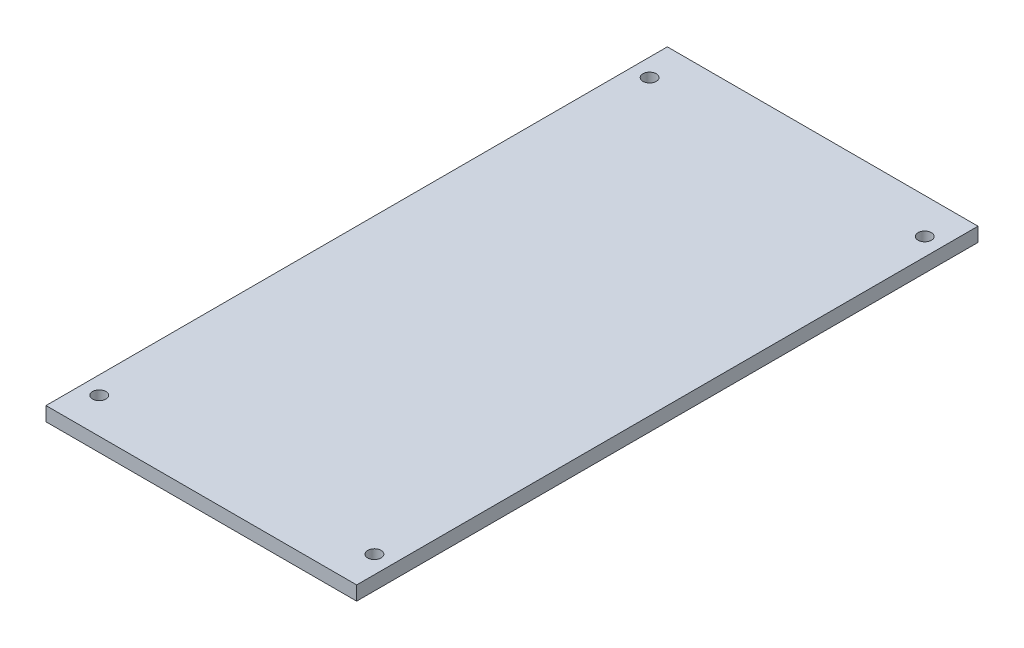
ISO-10303-21;
HEADER;
FILE_DESCRIPTION(('STEP AP214'),'2;1');
FILE_NAME('part.step','',(''),(''),'','','');
FILE_SCHEMA(('AUTOMOTIVE_DESIGN { 1 0 10303 214 1 1 1 1 }'));
ENDSEC;
DATA;
#1=APPLICATION_CONTEXT('core data for automotive mechanical design processes');
#2=APPLICATION_PROTOCOL_DEFINITION('international standard','automotive_design',2000,#1);
#3=PRODUCT_CONTEXT('',#1,'mechanical');
#4=PRODUCT('Part','Part','',(#3));
#5=PRODUCT_RELATED_PRODUCT_CATEGORY('part','',(#4));
#6=PRODUCT_DEFINITION_FORMATION('','',#4);
#7=PRODUCT_DEFINITION_CONTEXT('part definition',#1,'design');
#8=PRODUCT_DEFINITION('design','',#6,#7);
#9=PRODUCT_DEFINITION_SHAPE('','',#8);
#10=(LENGTH_UNIT() NAMED_UNIT(*) SI_UNIT(.MILLI.,.METRE.));
#11=(NAMED_UNIT(*) PLANE_ANGLE_UNIT() SI_UNIT($,.RADIAN.));
#12=(NAMED_UNIT(*) SI_UNIT($,.STERADIAN.) SOLID_ANGLE_UNIT());
#13=UNCERTAINTY_MEASURE_WITH_UNIT(LENGTH_MEASURE(1.E-05),#10,'distance_accuracy_value','');
#14=(GEOMETRIC_REPRESENTATION_CONTEXT(3) GLOBAL_UNCERTAINTY_ASSIGNED_CONTEXT((#13)) GLOBAL_UNIT_ASSIGNED_CONTEXT((#10,
#11,#12)) REPRESENTATION_CONTEXT('',''));
#15=CARTESIAN_POINT('',(0.,0.,0.));
#16=DIRECTION('',(0.,0.,1.));
#17=DIRECTION('',(1.,0.,0.));
#18=AXIS2_PLACEMENT_3D('',#15,#16,#17);
#19=CARTESIAN_POINT('',(0.,3.175,0.));
#20=DIRECTION('',(0.,1.,0.));
#21=DIRECTION('',(0.,0.,1.));
#22=AXIS2_PLACEMENT_3D('',#19,#20,#21);
#23=PLANE('',#22);
#24=CARTESIAN_POINT('',(-31.,3.175,-62.0000000000001));
#25=DIRECTION('',(0.,1.,0.));
#26=DIRECTION('',(0.,0.,1.));
#27=AXIS2_PLACEMENT_3D('',#24,#25,#26);
#28=CIRCLE('',#27,1.5);
#29=CARTESIAN_POINT('',(-31.,3.175,-60.5000000000001));
#30=VERTEX_POINT('',#29);
#31=EDGE_CURVE('E121',#30,#30,#28,.T.);
#32=ORIENTED_EDGE('',*,*,#31,.F.);
#33=EDGE_LOOP('',(#32));
#34=FACE_BOUND('',#33,.T.);
#35=CARTESIAN_POINT('',(31.,3.175,62.));
#36=DIRECTION('',(0.,1.,0.));
#37=DIRECTION('',(0.,0.,1.));
#38=AXIS2_PLACEMENT_3D('',#35,#36,#37);
#39=CIRCLE('',#38,1.5);
#40=CARTESIAN_POINT('',(31.,3.175,63.5));
#41=VERTEX_POINT('',#40);
#42=EDGE_CURVE('E100',#41,#41,#39,.T.);
#43=ORIENTED_EDGE('',*,*,#42,.F.);
#44=EDGE_LOOP('',(#43));
#45=FACE_BOUND('',#44,.T.);
#46=DIRECTION('',(0.,0.,1.));
#47=VECTOR('',#46,1.);
#48=CARTESIAN_POINT('',(-35.,3.175,70.));
#49=LINE('',#48,#47);
#50=CARTESIAN_POINT('',(-35.,3.175,-70.));
#51=VERTEX_POINT('',#50);
#52=CARTESIAN_POINT('',(-35.,3.175,70.));
#53=VERTEX_POINT('',#52);
#54=EDGE_CURVE('E85',#51,#53,#49,.T.);
#55=ORIENTED_EDGE('',*,*,#54,.T.);
#56=DIRECTION('',(1.,0.,0.));
#57=VECTOR('',#56,1.);
#58=CARTESIAN_POINT('',(35.,3.175,70.));
#59=LINE('',#58,#57);
#60=CARTESIAN_POINT('',(35.,3.175,70.));
#61=VERTEX_POINT('',#60);
#62=EDGE_CURVE('E80',#53,#61,#59,.T.);
#63=ORIENTED_EDGE('',*,*,#62,.T.);
#64=DIRECTION('',(0.,0.,-1.));
#65=VECTOR('',#64,1.);
#66=CARTESIAN_POINT('',(35.,3.175,70.));
#67=LINE('',#66,#65);
#68=CARTESIAN_POINT('',(35.,3.175,-70.));
#69=VERTEX_POINT('',#68);
#70=EDGE_CURVE('E83',#61,#69,#67,.T.);
#71=ORIENTED_EDGE('',*,*,#70,.T.);
#72=DIRECTION('',(-1.,0.,0.));
#73=VECTOR('',#72,1.);
#74=CARTESIAN_POINT('',(35.,3.175,-70.));
#75=LINE('',#74,#73);
#76=EDGE_CURVE('E50',#69,#51,#75,.T.);
#77=ORIENTED_EDGE('',*,*,#76,.T.);
#78=EDGE_LOOP('',(#55,#63,#71,#77));
#79=FACE_BOUND('',#78,.T.);
#80=CARTESIAN_POINT('',(30.9999999999999,3.175,-62.0000000000001));
#81=DIRECTION('',(0.,1.,0.));
#82=DIRECTION('',(0.,0.,-1.));
#83=AXIS2_PLACEMENT_3D('',#80,#81,#82);
#84=CIRCLE('',#83,1.5);
#85=CARTESIAN_POINT('',(30.9999999999999,3.175,-63.5000000000001));
#86=VERTEX_POINT('',#85);
#87=EDGE_CURVE('E115',#86,#86,#84,.T.);
#88=ORIENTED_EDGE('',*,*,#87,.F.);
#89=EDGE_LOOP('',(#88));
#90=FACE_BOUND('',#89,.T.);
#91=CARTESIAN_POINT('',(-31.,3.175,62.));
#92=DIRECTION('',(0.,1.,0.));
#93=DIRECTION('',(0.,0.,-1.));
#94=AXIS2_PLACEMENT_3D('',#91,#92,#93);
#95=CIRCLE('',#94,1.5);
#96=CARTESIAN_POINT('',(-31.,3.175,60.5));
#97=VERTEX_POINT('',#96);
#98=EDGE_CURVE('E127',#97,#97,#95,.T.);
#99=ORIENTED_EDGE('',*,*,#98,.F.);
#100=EDGE_LOOP('',(#99));
#101=FACE_BOUND('',#100,.T.);
#102=ADVANCED_FACE('F33',(#34,#45,#79,#90,#101),#23,.T.);
#103=CARTESIAN_POINT('',(0.,0.,0.));
#104=DIRECTION('',(0.,1.,0.));
#105=DIRECTION('',(0.,0.,1.));
#106=AXIS2_PLACEMENT_3D('',#103,#104,#105);
#107=PLANE('',#106);
#108=CARTESIAN_POINT('',(-31.,0.,-62.0000000000001));
#109=DIRECTION('',(0.,1.,0.));
#110=DIRECTION('',(0.,0.,1.));
#111=AXIS2_PLACEMENT_3D('',#108,#109,#110);
#112=CIRCLE('',#111,1.5);
#113=CARTESIAN_POINT('',(-31.,0.,-60.5000000000001));
#114=VERTEX_POINT('',#113);
#115=EDGE_CURVE('E124',#114,#114,#112,.T.);
#116=ORIENTED_EDGE('',*,*,#115,.T.);
#117=EDGE_LOOP('',(#116));
#118=FACE_BOUND('',#117,.T.);
#119=CARTESIAN_POINT('',(31.,0.,62.));
#120=DIRECTION('',(0.,1.,0.));
#121=DIRECTION('',(0.,0.,1.));
#122=AXIS2_PLACEMENT_3D('',#119,#120,#121);
#123=CIRCLE('',#122,1.5);
#124=CARTESIAN_POINT('',(31.,0.,63.5));
#125=VERTEX_POINT('',#124);
#126=EDGE_CURVE('E112',#125,#125,#123,.T.);
#127=ORIENTED_EDGE('',*,*,#126,.T.);
#128=EDGE_LOOP('',(#127));
#129=FACE_BOUND('',#128,.T.);
#130=DIRECTION('',(0.,0.,1.));
#131=VECTOR('',#130,1.);
#132=CARTESIAN_POINT('',(-35.,0.,70.));
#133=LINE('',#132,#131);
#134=CARTESIAN_POINT('',(-35.,0.,-70.));
#135=VERTEX_POINT('',#134);
#136=CARTESIAN_POINT('',(-35.,0.,70.));
#137=VERTEX_POINT('',#136);
#138=EDGE_CURVE('E97',#135,#137,#133,.T.);
#139=ORIENTED_EDGE('',*,*,#138,.F.);
#140=DIRECTION('',(-1.,0.,0.));
#141=VECTOR('',#140,1.);
#142=CARTESIAN_POINT('',(35.,0.,-70.));
#143=LINE('',#142,#141);
#144=CARTESIAN_POINT('',(35.,0.,-70.));
#145=VERTEX_POINT('',#144);
#146=EDGE_CURVE('E73',#145,#135,#143,.T.);
#147=ORIENTED_EDGE('',*,*,#146,.F.);
#148=DIRECTION('',(0.,0.,-1.));
#149=VECTOR('',#148,1.);
#150=CARTESIAN_POINT('',(35.,0.,70.));
#151=LINE('',#150,#149);
#152=CARTESIAN_POINT('',(35.,0.,70.));
#153=VERTEX_POINT('',#152);
#154=EDGE_CURVE('E67',#153,#145,#151,.T.);
#155=ORIENTED_EDGE('',*,*,#154,.F.);
#156=DIRECTION('',(1.,0.,0.));
#157=VECTOR('',#156,1.);
#158=CARTESIAN_POINT('',(35.,0.,70.));
#159=LINE('',#158,#157);
#160=EDGE_CURVE('E89',#137,#153,#159,.T.);
#161=ORIENTED_EDGE('',*,*,#160,.F.);
#162=EDGE_LOOP('',(#139,#147,#155,#161));
#163=FACE_BOUND('',#162,.T.);
#164=CARTESIAN_POINT('',(30.9999999999999,0.,-62.0000000000001));
#165=DIRECTION('',(0.,1.,0.));
#166=DIRECTION('',(0.,0.,-1.));
#167=AXIS2_PLACEMENT_3D('',#164,#165,#166);
#168=CIRCLE('',#167,1.5);
#169=CARTESIAN_POINT('',(30.9999999999999,0.,-63.5000000000001));
#170=VERTEX_POINT('',#169);
#171=EDGE_CURVE('E118',#170,#170,#168,.T.);
#172=ORIENTED_EDGE('',*,*,#171,.T.);
#173=EDGE_LOOP('',(#172));
#174=FACE_BOUND('',#173,.T.);
#175=CARTESIAN_POINT('',(-31.,0.,62.));
#176=DIRECTION('',(0.,1.,0.));
#177=DIRECTION('',(0.,0.,-1.));
#178=AXIS2_PLACEMENT_3D('',#175,#176,#177);
#179=CIRCLE('',#178,1.5);
#180=CARTESIAN_POINT('',(-31.,0.,60.5));
#181=VERTEX_POINT('',#180);
#182=EDGE_CURVE('E130',#181,#181,#179,.T.);
#183=ORIENTED_EDGE('',*,*,#182,.T.);
#184=EDGE_LOOP('',(#183));
#185=FACE_BOUND('',#184,.T.);
#186=ADVANCED_FACE('F108',(#118,#129,#163,#174,#185),#107,.F.);
#187=CARTESIAN_POINT('',(-35.,3.175,70.));
#188=DIRECTION('',(1.,0.,0.));
#189=DIRECTION('',(0.,0.,-1.));
#190=AXIS2_PLACEMENT_3D('',#187,#188,#189);
#191=PLANE('',#190);
#192=ORIENTED_EDGE('',*,*,#138,.T.);
#193=DIRECTION('',(0.,-1.,0.));
#194=VECTOR('',#193,1.);
#195=CARTESIAN_POINT('',(-35.,3.175,70.));
#196=LINE('',#195,#194);
#197=EDGE_CURVE('E11',#53,#137,#196,.T.);
#198=ORIENTED_EDGE('',*,*,#197,.F.);
#199=ORIENTED_EDGE('',*,*,#54,.F.);
#200=DIRECTION('',(0.,-1.,0.));
#201=VECTOR('',#200,1.);
#202=CARTESIAN_POINT('',(-35.,3.175,-70.));
#203=LINE('',#202,#201);
#204=EDGE_CURVE('E93',#51,#135,#203,.T.);
#205=ORIENTED_EDGE('',*,*,#204,.T.);
#206=EDGE_LOOP('',(#192,#198,#199,#205));
#207=FACE_BOUND('',#206,.T.);
#208=ADVANCED_FACE('F35',(#207),#191,.F.);
#209=CARTESIAN_POINT('',(35.,3.175,70.));
#210=DIRECTION('',(0.,0.,-1.));
#211=DIRECTION('',(-1.,0.,0.));
#212=AXIS2_PLACEMENT_3D('',#209,#210,#211);
#213=PLANE('',#212);
#214=ORIENTED_EDGE('',*,*,#160,.T.);
#215=DIRECTION('',(0.,-1.,0.));
#216=VECTOR('',#215,1.);
#217=CARTESIAN_POINT('',(35.,3.175,70.));
#218=LINE('',#217,#216);
#219=EDGE_CURVE('E42',#61,#153,#218,.T.);
#220=ORIENTED_EDGE('',*,*,#219,.F.);
#221=ORIENTED_EDGE('',*,*,#62,.F.);
#222=ORIENTED_EDGE('',*,*,#197,.T.);
#223=EDGE_LOOP('',(#214,#220,#221,#222));
#224=FACE_BOUND('',#223,.T.);
#225=ADVANCED_FACE('F88',(#224),#213,.F.);
#226=CARTESIAN_POINT('',(35.,3.175,70.));
#227=DIRECTION('',(-1.,0.,0.));
#228=DIRECTION('',(0.,0.,1.));
#229=AXIS2_PLACEMENT_3D('',#226,#227,#228);
#230=PLANE('',#229);
#231=ORIENTED_EDGE('',*,*,#154,.T.);
#232=DIRECTION('',(0.,-1.,0.));
#233=VECTOR('',#232,1.);
#234=CARTESIAN_POINT('',(35.,3.175,-70.));
#235=LINE('',#234,#233);
#236=EDGE_CURVE('E90',#69,#145,#235,.T.);
#237=ORIENTED_EDGE('',*,*,#236,.F.);
#238=ORIENTED_EDGE('',*,*,#70,.F.);
#239=ORIENTED_EDGE('',*,*,#219,.T.);
#240=EDGE_LOOP('',(#231,#237,#238,#239));
#241=FACE_BOUND('',#240,.T.);
#242=ADVANCED_FACE('F91',(#241),#230,.F.);
#243=CARTESIAN_POINT('',(35.,3.175,-70.));
#244=DIRECTION('',(0.,0.,1.));
#245=DIRECTION('',(1.,0.,0.));
#246=AXIS2_PLACEMENT_3D('',#243,#244,#245);
#247=PLANE('',#246);
#248=ORIENTED_EDGE('',*,*,#146,.T.);
#249=ORIENTED_EDGE('',*,*,#204,.F.);
#250=ORIENTED_EDGE('',*,*,#76,.F.);
#251=ORIENTED_EDGE('',*,*,#236,.T.);
#252=EDGE_LOOP('',(#248,#249,#250,#251));
#253=FACE_BOUND('',#252,.T.);
#254=ADVANCED_FACE('F105',(#253),#247,.F.);
#255=CARTESIAN_POINT('',(31.,3.175,62.));
#256=DIRECTION('',(0.,-1.,0.));
#257=DIRECTION('',(0.,0.,-1.));
#258=AXIS2_PLACEMENT_3D('',#255,#256,#257);
#259=CYLINDRICAL_SURFACE('',#258,1.5);
#260=ORIENTED_EDGE('',*,*,#42,.T.);
#261=EDGE_LOOP('',(#260));
#262=FACE_BOUND('',#261,.T.);
#263=ORIENTED_EDGE('',*,*,#126,.F.);
#264=EDGE_LOOP('',(#263));
#265=FACE_BOUND('',#264,.T.);
#266=ADVANCED_FACE('F150',(#262,#265),#259,.F.);
#267=CARTESIAN_POINT('',(30.9999999999999,3.175,-62.0000000000001));
#268=DIRECTION('',(0.,-1.,0.));
#269=DIRECTION('',(0.,0.,-1.));
#270=AXIS2_PLACEMENT_3D('',#267,#268,#269);
#271=CYLINDRICAL_SURFACE('',#270,1.5);
#272=ORIENTED_EDGE('',*,*,#87,.T.);
#273=EDGE_LOOP('',(#272));
#274=FACE_BOUND('',#273,.T.);
#275=ORIENTED_EDGE('',*,*,#171,.F.);
#276=EDGE_LOOP('',(#275));
#277=FACE_BOUND('',#276,.T.);
#278=ADVANCED_FACE('F196',(#274,#277),#271,.F.);
#279=CARTESIAN_POINT('',(-31.,3.175,-62.0000000000001));
#280=DIRECTION('',(0.,-1.,0.));
#281=DIRECTION('',(0.,0.,-1.));
#282=AXIS2_PLACEMENT_3D('',#279,#280,#281);
#283=CYLINDRICAL_SURFACE('',#282,1.5);
#284=ORIENTED_EDGE('',*,*,#31,.T.);
#285=EDGE_LOOP('',(#284));
#286=FACE_BOUND('',#285,.T.);
#287=ORIENTED_EDGE('',*,*,#115,.F.);
#288=EDGE_LOOP('',(#287));
#289=FACE_BOUND('',#288,.T.);
#290=ADVANCED_FACE('F204',(#286,#289),#283,.F.);
#291=CARTESIAN_POINT('',(-31.,3.175,62.));
#292=DIRECTION('',(0.,-1.,0.));
#293=DIRECTION('',(0.,0.,-1.));
#294=AXIS2_PLACEMENT_3D('',#291,#292,#293);
#295=CYLINDRICAL_SURFACE('',#294,1.5);
#296=ORIENTED_EDGE('',*,*,#98,.T.);
#297=EDGE_LOOP('',(#296));
#298=FACE_BOUND('',#297,.T.);
#299=ORIENTED_EDGE('',*,*,#182,.F.);
#300=EDGE_LOOP('',(#299));
#301=FACE_BOUND('',#300,.T.);
#302=ADVANCED_FACE('F136',(#298,#301),#295,.F.);
#303=CLOSED_SHELL('',(#102,#186,#208,#225,#242,#254,#266,#278,#290,#302));
#304=MANIFOLD_SOLID_BREP('B2',#303);
#305=ADVANCED_BREP_SHAPE_REPRESENTATION('',(#18,#304),#14);
#306=SHAPE_DEFINITION_REPRESENTATION(#9,#305);
ENDSEC;
END-ISO-10303-21;
